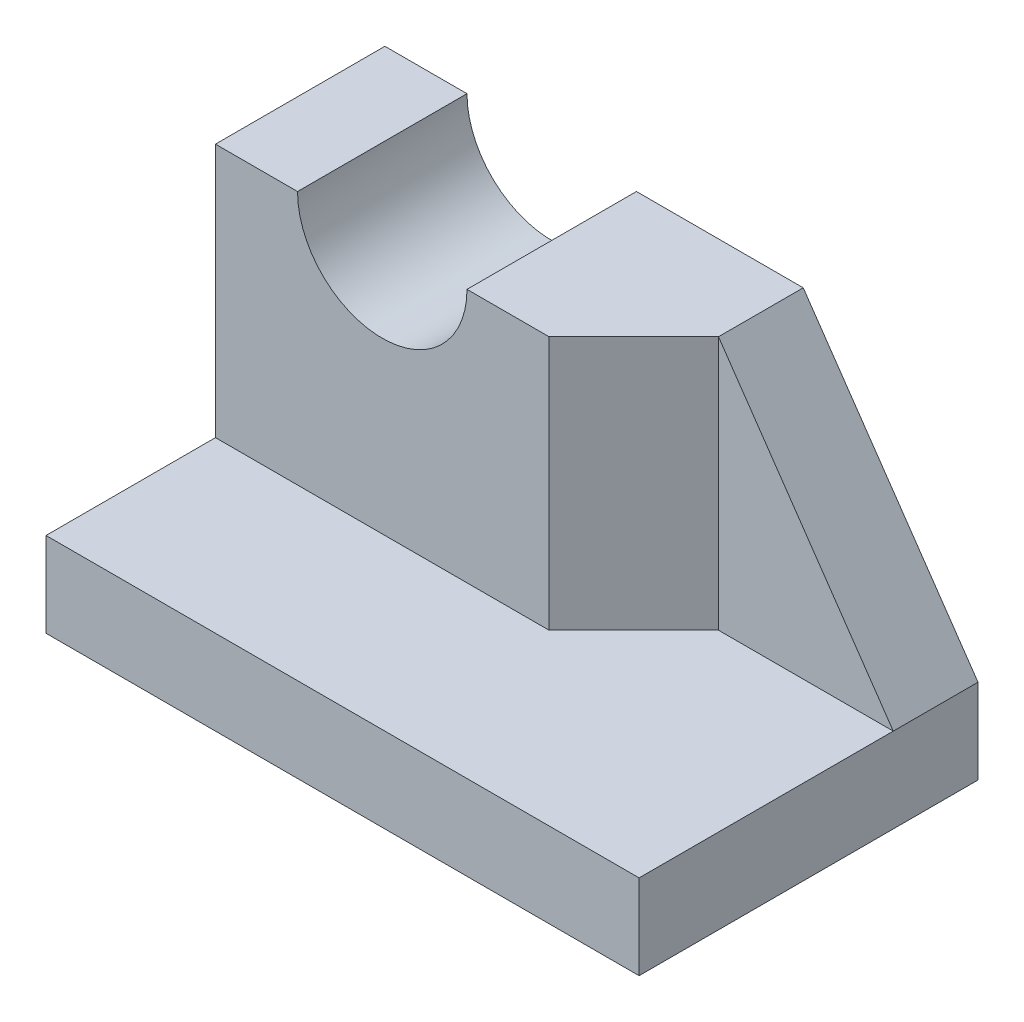
ISO-10303-21;
HEADER;
FILE_DESCRIPTION(('STEP AP214'),'2;1');
FILE_NAME('part.step','',(''),(''),'','','');
FILE_SCHEMA(('AUTOMOTIVE_DESIGN { 1 0 10303 214 1 1 1 1 }'));
ENDSEC;
DATA;
#1=APPLICATION_CONTEXT('core data for automotive mechanical design processes');
#2=APPLICATION_PROTOCOL_DEFINITION('international standard','automotive_design',2000,#1);
#3=PRODUCT_CONTEXT('',#1,'mechanical');
#4=PRODUCT('Part','Part','',(#3));
#5=PRODUCT_RELATED_PRODUCT_CATEGORY('part','',(#4));
#6=PRODUCT_DEFINITION_FORMATION('','',#4);
#7=PRODUCT_DEFINITION_CONTEXT('part definition',#1,'design');
#8=PRODUCT_DEFINITION('design','',#6,#7);
#9=PRODUCT_DEFINITION_SHAPE('','',#8);
#10=(LENGTH_UNIT() NAMED_UNIT(*) SI_UNIT(.MILLI.,.METRE.));
#11=(NAMED_UNIT(*) PLANE_ANGLE_UNIT() SI_UNIT($,.RADIAN.));
#12=(NAMED_UNIT(*) SI_UNIT($,.STERADIAN.) SOLID_ANGLE_UNIT());
#13=UNCERTAINTY_MEASURE_WITH_UNIT(LENGTH_MEASURE(1.E-05),#10,'distance_accuracy_value','');
#14=(GEOMETRIC_REPRESENTATION_CONTEXT(3) GLOBAL_UNCERTAINTY_ASSIGNED_CONTEXT((#13)) GLOBAL_UNIT_ASSIGNED_CONTEXT((#10,
#11,#12)) REPRESENTATION_CONTEXT('',''));
#15=CARTESIAN_POINT('',(0.,0.,0.));
#16=DIRECTION('',(0.,0.,1.));
#17=DIRECTION('',(1.,0.,0.));
#18=AXIS2_PLACEMENT_3D('',#15,#16,#17);
#19=CARTESIAN_POINT('',(35.,10.,-20.));
#20=DIRECTION('',(-1.,0.,0.));
#21=DIRECTION('',(0.,0.,1.));
#22=AXIS2_PLACEMENT_3D('',#19,#20,#21);
#23=PLANE('',#22);
#24=DIRECTION('',(0.,0.,1.));
#25=VECTOR('',#24,1.);
#26=CARTESIAN_POINT('',(35.,10.,-20.));
#27=LINE('',#26,#25);
#28=CARTESIAN_POINT('',(35.,10.,-20.));
#29=VERTEX_POINT('',#28);
#30=CARTESIAN_POINT('',(35.,10.,-10.));
#31=VERTEX_POINT('',#30);
#32=EDGE_CURVE('E133',#29,#31,#27,.T.);
#33=ORIENTED_EDGE('',*,*,#32,.T.);
#34=DIRECTION('',(0.,0.,-1.));
#35=VECTOR('',#34,1.);
#36=CARTESIAN_POINT('',(35.,10.,-20.));
#37=LINE('',#36,#35);
#38=CARTESIAN_POINT('',(35.,10.,20.));
#39=VERTEX_POINT('',#38);
#40=EDGE_CURVE('E180',#39,#31,#37,.T.);
#41=ORIENTED_EDGE('',*,*,#40,.F.);
#42=DIRECTION('',(0.,-1.,0.));
#43=VECTOR('',#42,1.);
#44=CARTESIAN_POINT('',(35.,10.,20.));
#45=LINE('',#44,#43);
#46=CARTESIAN_POINT('',(35.,0.,20.));
#47=VERTEX_POINT('',#46);
#48=EDGE_CURVE('E191',#39,#47,#45,.T.);
#49=ORIENTED_EDGE('',*,*,#48,.T.);
#50=DIRECTION('',(0.,0.,-1.));
#51=VECTOR('',#50,1.);
#52=CARTESIAN_POINT('',(35.,0.,-20.));
#53=LINE('',#52,#51);
#54=CARTESIAN_POINT('',(35.,0.,-20.));
#55=VERTEX_POINT('',#54);
#56=EDGE_CURVE('E179',#47,#55,#53,.T.);
#57=ORIENTED_EDGE('',*,*,#56,.T.);
#58=DIRECTION('',(0.,-1.,0.));
#59=VECTOR('',#58,1.);
#60=CARTESIAN_POINT('',(35.,10.,-20.));
#61=LINE('',#60,#59);
#62=EDGE_CURVE('E12',#29,#55,#61,.T.);
#63=ORIENTED_EDGE('',*,*,#62,.F.);
#64=EDGE_LOOP('',(#33,#41,#49,#57,#63));
#65=FACE_BOUND('',#64,.T.);
#66=ADVANCED_FACE('F40',(#65),#23,.F.);
#67=CARTESIAN_POINT('',(-35.,10.,-20.));
#68=DIRECTION('',(0.,0.,1.));
#69=DIRECTION('',(1.,0.,0.));
#70=AXIS2_PLACEMENT_3D('',#67,#68,#69);
#71=PLANE('',#70);
#72=CARTESIAN_POINT('',(-15.3135783502634,40.,-20.));
#73=DIRECTION('',(0.,0.,-1.));
#74=DIRECTION('',(1.,0.,0.));
#75=AXIS2_PLACEMENT_3D('',#72,#73,#74);
#76=CIRCLE('',#75,10.);
#77=CARTESIAN_POINT('',(-5.31357835026339,40.,-20.));
#78=VERTEX_POINT('',#77);
#79=CARTESIAN_POINT('',(-25.3135783502634,40.,-20.));
#80=VERTEX_POINT('',#79);
#81=EDGE_CURVE('E114',#78,#80,#76,.T.);
#82=ORIENTED_EDGE('',*,*,#81,.F.);
#83=DIRECTION('',(-1.,0.,0.));
#84=VECTOR('',#83,1.);
#85=CARTESIAN_POINT('',(35.,40.,-20.));
#86=LINE('',#85,#84);
#87=CARTESIAN_POINT('',(14.3728432994732,40.,-20.));
#88=VERTEX_POINT('',#87);
#89=EDGE_CURVE('E139',#88,#78,#86,.T.);
#90=ORIENTED_EDGE('',*,*,#89,.F.);
#91=DIRECTION('',(-0.566569047757044,0.824014268155398,0.));
#92=VECTOR('',#91,1.);
#93=CARTESIAN_POINT('',(35.,10.,-20.));
#94=LINE('',#93,#92);
#95=EDGE_CURVE('E63',#29,#88,#94,.T.);
#96=ORIENTED_EDGE('',*,*,#95,.F.);
#97=ORIENTED_EDGE('',*,*,#62,.T.);
#98=DIRECTION('',(-1.,0.,0.));
#99=VECTOR('',#98,1.);
#100=CARTESIAN_POINT('',(-35.,0.,-20.));
#101=LINE('',#100,#99);
#102=CARTESIAN_POINT('',(-35.,0.,-20.));
#103=VERTEX_POINT('',#102);
#104=EDGE_CURVE('E195',#55,#103,#101,.T.);
#105=ORIENTED_EDGE('',*,*,#104,.T.);
#106=DIRECTION('',(0.,-1.,0.));
#107=VECTOR('',#106,1.);
#108=CARTESIAN_POINT('',(-35.,10.,-20.));
#109=LINE('',#108,#107);
#110=CARTESIAN_POINT('',(-35.,40.,-20.));
#111=VERTEX_POINT('',#110);
#112=EDGE_CURVE('E48',#111,#103,#109,.T.);
#113=ORIENTED_EDGE('',*,*,#112,.F.);
#114=EDGE_CURVE('E128',#80,#111,#86,.T.);
#115=ORIENTED_EDGE('',*,*,#114,.F.);
#116=EDGE_LOOP('',(#82,#90,#96,#97,#105,#113,#115));
#117=FACE_BOUND('',#116,.T.);
#118=ADVANCED_FACE('F135',(#117),#71,.F.);
#119=CARTESIAN_POINT('',(-35.,40.,0.));
#120=DIRECTION('',(0.,0.,-1.));
#121=DIRECTION('',(-1.,0.,0.));
#122=AXIS2_PLACEMENT_3D('',#119,#120,#121);
#123=PLANE('',#122);
#124=CARTESIAN_POINT('',(-15.3135783502634,40.,0.));
#125=DIRECTION('',(0.,0.,-1.));
#126=DIRECTION('',(-1.,0.,0.));
#127=AXIS2_PLACEMENT_3D('',#124,#125,#126);
#128=CIRCLE('',#127,10.);
#129=CARTESIAN_POINT('',(-25.3135783502634,40.,0.));
#130=VERTEX_POINT('',#129);
#131=CARTESIAN_POINT('',(-5.31357835026339,40.,0.));
#132=VERTEX_POINT('',#131);
#133=EDGE_CURVE('E55',#130,#132,#128,.F.);
#134=ORIENTED_EDGE('',*,*,#133,.F.);
#135=DIRECTION('',(1.,0.,0.));
#136=VECTOR('',#135,1.);
#137=CARTESIAN_POINT('',(-35.,40.,0.));
#138=LINE('',#137,#136);
#139=CARTESIAN_POINT('',(-35.,40.,0.));
#140=VERTEX_POINT('',#139);
#141=EDGE_CURVE('E131',#140,#130,#138,.T.);
#142=ORIENTED_EDGE('',*,*,#141,.F.);
#143=DIRECTION('',(0.,-1.,0.));
#144=VECTOR('',#143,1.);
#145=CARTESIAN_POINT('',(-35.,40.,0.));
#146=LINE('',#145,#144);
#147=CARTESIAN_POINT('',(-35.,10.,0.));
#148=VERTEX_POINT('',#147);
#149=EDGE_CURVE('E175',#140,#148,#146,.T.);
#150=ORIENTED_EDGE('',*,*,#149,.T.);
#151=DIRECTION('',(1.,0.,0.));
#152=VECTOR('',#151,1.);
#153=CARTESIAN_POINT('',(-35.,10.,0.));
#154=LINE('',#153,#152);
#155=CARTESIAN_POINT('',(4.37284329947321,10.,0.));
#156=VERTEX_POINT('',#155);
#157=EDGE_CURVE('E161',#148,#156,#154,.T.);
#158=ORIENTED_EDGE('',*,*,#157,.T.);
#159=DIRECTION('',(0.,-1.,0.));
#160=VECTOR('',#159,1.);
#161=CARTESIAN_POINT('',(4.37284329947321,40.,0.));
#162=LINE('',#161,#160);
#163=CARTESIAN_POINT('',(4.37284329947321,40.,0.));
#164=VERTEX_POINT('',#163);
#165=EDGE_CURVE('E171',#164,#156,#162,.T.);
#166=ORIENTED_EDGE('',*,*,#165,.F.);
#167=EDGE_CURVE('E153',#132,#164,#138,.T.);
#168=ORIENTED_EDGE('',*,*,#167,.F.);
#169=EDGE_LOOP('',(#134,#142,#150,#158,#166,#168));
#170=FACE_BOUND('',#169,.T.);
#171=ADVANCED_FACE('F241',(#170),#123,.F.);
#172=CARTESIAN_POINT('',(14.3728432994732,40.,-10.));
#173=DIRECTION('',(0.,0.,-1.));
#174=DIRECTION('',(-1.,0.,0.));
#175=AXIS2_PLACEMENT_3D('',#172,#173,#174);
#176=PLANE('',#175);
#177=DIRECTION('',(0.566569047757044,-0.824014268155398,0.));
#178=VECTOR('',#177,1.);
#179=CARTESIAN_POINT('',(14.3728432994732,40.,-10.));
#180=LINE('',#179,#178);
#181=CARTESIAN_POINT('',(14.3728432994732,40.,-10.));
#182=VERTEX_POINT('',#181);
#183=EDGE_CURVE('E233',#182,#31,#180,.T.);
#184=ORIENTED_EDGE('',*,*,#183,.F.);
#185=DIRECTION('',(0.,-1.,0.));
#186=VECTOR('',#185,1.);
#187=CARTESIAN_POINT('',(14.3728432994732,40.,-10.));
#188=LINE('',#187,#186);
#189=CARTESIAN_POINT('',(14.3728432994732,10.,-10.));
#190=VERTEX_POINT('',#189);
#191=EDGE_CURVE('E160',#182,#190,#188,.T.);
#192=ORIENTED_EDGE('',*,*,#191,.T.);
#193=DIRECTION('',(1.,0.,0.));
#194=VECTOR('',#193,1.);
#195=CARTESIAN_POINT('',(14.3728432994732,10.,-10.));
#196=LINE('',#195,#194);
#197=EDGE_CURVE('E140',#190,#31,#196,.T.);
#198=ORIENTED_EDGE('',*,*,#197,.T.);
#199=EDGE_LOOP('',(#184,#192,#198));
#200=FACE_BOUND('',#199,.T.);
#201=ADVANCED_FACE('F232',(#200),#176,.F.);
#202=CARTESIAN_POINT('',(0.,40.,0.));
#203=DIRECTION('',(0.,1.,0.));
#204=DIRECTION('',(0.,0.,1.));
#205=AXIS2_PLACEMENT_3D('',#202,#203,#204);
#206=PLANE('',#205);
#207=ORIENTED_EDGE('',*,*,#141,.T.);
#208=DIRECTION('',(0.,0.,1.));
#209=VECTOR('',#208,1.);
#210=CARTESIAN_POINT('',(-25.3135783502634,40.,-20.));
#211=LINE('',#210,#209);
#212=EDGE_CURVE('E117',#80,#130,#211,.T.);
#213=ORIENTED_EDGE('',*,*,#212,.F.);
#214=ORIENTED_EDGE('',*,*,#114,.T.);
#215=DIRECTION('',(0.,0.,1.));
#216=VECTOR('',#215,1.);
#217=CARTESIAN_POINT('',(-35.,40.,-20.));
#218=LINE('',#217,#216);
#219=EDGE_CURVE('E144',#111,#140,#218,.T.);
#220=ORIENTED_EDGE('',*,*,#219,.T.);
#221=EDGE_LOOP('',(#207,#213,#214,#220));
#222=FACE_BOUND('',#221,.T.);
#223=ADVANCED_FACE('F127',(#222),#206,.T.);
#224=ORIENTED_EDGE('',*,*,#89,.T.);
#225=DIRECTION('',(0.,0.,1.));
#226=VECTOR('',#225,1.);
#227=CARTESIAN_POINT('',(-5.31357835026339,40.,-20.));
#228=LINE('',#227,#226);
#229=EDGE_CURVE('E118',#78,#132,#228,.T.);
#230=ORIENTED_EDGE('',*,*,#229,.T.);
#231=ORIENTED_EDGE('',*,*,#167,.T.);
#232=DIRECTION('',(0.707106781186546,0.,-0.707106781186549));
#233=VECTOR('',#232,1.);
#234=CARTESIAN_POINT('',(4.37284329947321,40.,0.));
#235=LINE('',#234,#233);
#236=EDGE_CURVE('E156',#164,#182,#235,.T.);
#237=ORIENTED_EDGE('',*,*,#236,.T.);
#238=DIRECTION('',(0.,0.,1.));
#239=VECTOR('',#238,1.);
#240=CARTESIAN_POINT('',(14.3728432994732,40.,-20.));
#241=LINE('',#240,#239);
#242=EDGE_CURVE('E246',#88,#182,#241,.T.);
#243=ORIENTED_EDGE('',*,*,#242,.F.);
#244=EDGE_LOOP('',(#224,#230,#231,#237,#243));
#245=FACE_BOUND('',#244,.T.);
#246=ADVANCED_FACE('F256',(#245),#206,.T.);
#247=CARTESIAN_POINT('',(-35.,10.,-20.));
#248=DIRECTION('',(1.,0.,0.));
#249=DIRECTION('',(0.,0.,-1.));
#250=AXIS2_PLACEMENT_3D('',#247,#248,#249);
#251=PLANE('',#250);
#252=DIRECTION('',(0.,0.,1.));
#253=VECTOR('',#252,1.);
#254=CARTESIAN_POINT('',(-35.,0.,-20.));
#255=LINE('',#254,#253);
#256=CARTESIAN_POINT('',(-35.,0.,20.));
#257=VERTEX_POINT('',#256);
#258=EDGE_CURVE('E198',#103,#257,#255,.T.);
#259=ORIENTED_EDGE('',*,*,#258,.T.);
#260=DIRECTION('',(0.,-1.,0.));
#261=VECTOR('',#260,1.);
#262=CARTESIAN_POINT('',(-35.,10.,20.));
#263=LINE('',#262,#261);
#264=CARTESIAN_POINT('',(-35.,10.,20.));
#265=VERTEX_POINT('',#264);
#266=EDGE_CURVE('E206',#265,#257,#263,.T.);
#267=ORIENTED_EDGE('',*,*,#266,.F.);
#268=DIRECTION('',(0.,0.,1.));
#269=VECTOR('',#268,1.);
#270=CARTESIAN_POINT('',(-35.,10.,-20.));
#271=LINE('',#270,#269);
#272=EDGE_CURVE('E184',#148,#265,#271,.T.);
#273=ORIENTED_EDGE('',*,*,#272,.F.);
#274=ORIENTED_EDGE('',*,*,#149,.F.);
#275=ORIENTED_EDGE('',*,*,#219,.F.);
#276=ORIENTED_EDGE('',*,*,#112,.T.);
#277=EDGE_LOOP('',(#259,#267,#273,#274,#275,#276));
#278=FACE_BOUND('',#277,.T.);
#279=ADVANCED_FACE('F212',(#278),#251,.F.);
#280=CARTESIAN_POINT('',(-35.,10.,20.));
#281=DIRECTION('',(0.,0.,-1.));
#282=DIRECTION('',(-1.,0.,0.));
#283=AXIS2_PLACEMENT_3D('',#280,#281,#282);
#284=PLANE('',#283);
#285=DIRECTION('',(1.,0.,0.));
#286=VECTOR('',#285,1.);
#287=CARTESIAN_POINT('',(-35.,0.,20.));
#288=LINE('',#287,#286);
#289=EDGE_CURVE('E185',#257,#47,#288,.T.);
#290=ORIENTED_EDGE('',*,*,#289,.T.);
#291=ORIENTED_EDGE('',*,*,#48,.F.);
#292=DIRECTION('',(1.,0.,0.));
#293=VECTOR('',#292,1.);
#294=CARTESIAN_POINT('',(-35.,10.,20.));
#295=LINE('',#294,#293);
#296=EDGE_CURVE('E188',#265,#39,#295,.T.);
#297=ORIENTED_EDGE('',*,*,#296,.F.);
#298=ORIENTED_EDGE('',*,*,#266,.T.);
#299=EDGE_LOOP('',(#290,#291,#297,#298));
#300=FACE_BOUND('',#299,.T.);
#301=ADVANCED_FACE('F222',(#300),#284,.F.);
#302=CARTESIAN_POINT('',(0.,10.,0.));
#303=DIRECTION('',(0.,1.,0.));
#304=DIRECTION('',(0.,0.,1.));
#305=AXIS2_PLACEMENT_3D('',#302,#303,#304);
#306=PLANE('',#305);
#307=ORIENTED_EDGE('',*,*,#197,.F.);
#308=DIRECTION('',(0.707106781186546,0.,-0.707106781186549));
#309=VECTOR('',#308,1.);
#310=CARTESIAN_POINT('',(4.37284329947321,10.,0.));
#311=LINE('',#310,#309);
#312=EDGE_CURVE('E146',#156,#190,#311,.T.);
#313=ORIENTED_EDGE('',*,*,#312,.F.);
#314=ORIENTED_EDGE('',*,*,#157,.F.);
#315=ORIENTED_EDGE('',*,*,#272,.T.);
#316=ORIENTED_EDGE('',*,*,#296,.T.);
#317=ORIENTED_EDGE('',*,*,#40,.T.);
#318=EDGE_LOOP('',(#307,#313,#314,#315,#316,#317));
#319=FACE_BOUND('',#318,.T.);
#320=ADVANCED_FACE('F229',(#319),#306,.T.);
#321=CARTESIAN_POINT('',(0.,0.,0.));
#322=DIRECTION('',(0.,1.,0.));
#323=DIRECTION('',(0.,0.,1.));
#324=AXIS2_PLACEMENT_3D('',#321,#322,#323);
#325=PLANE('',#324);
#326=ORIENTED_EDGE('',*,*,#56,.F.);
#327=ORIENTED_EDGE('',*,*,#289,.F.);
#328=ORIENTED_EDGE('',*,*,#258,.F.);
#329=ORIENTED_EDGE('',*,*,#104,.F.);
#330=EDGE_LOOP('',(#326,#327,#328,#329));
#331=FACE_BOUND('',#330,.T.);
#332=ADVANCED_FACE('F219',(#331),#325,.F.);
#333=CARTESIAN_POINT('',(4.37284329947321,40.,0.));
#334=DIRECTION('',(-0.707106781186549,0.,-0.707106781186546));
#335=DIRECTION('',(-0.707106781186546,0.,0.707106781186549));
#336=AXIS2_PLACEMENT_3D('',#333,#334,#335);
#337=PLANE('',#336);
#338=ORIENTED_EDGE('',*,*,#312,.T.);
#339=ORIENTED_EDGE('',*,*,#191,.F.);
#340=ORIENTED_EDGE('',*,*,#236,.F.);
#341=ORIENTED_EDGE('',*,*,#165,.T.);
#342=EDGE_LOOP('',(#338,#339,#340,#341));
#343=FACE_BOUND('',#342,.T.);
#344=ADVANCED_FACE('F237',(#343),#337,.F.);
#345=CARTESIAN_POINT('',(35.,10.,-20.));
#346=DIRECTION('',(0.824014268155398,0.566569047757044,0.));
#347=DIRECTION('',(-0.566569047757044,0.824014268155398,0.));
#348=AXIS2_PLACEMENT_3D('',#345,#346,#347);
#349=PLANE('',#348);
#350=ORIENTED_EDGE('',*,*,#183,.T.);
#351=ORIENTED_EDGE('',*,*,#32,.F.);
#352=ORIENTED_EDGE('',*,*,#95,.T.);
#353=ORIENTED_EDGE('',*,*,#242,.T.);
#354=EDGE_LOOP('',(#350,#351,#352,#353));
#355=FACE_BOUND('',#354,.T.);
#356=ADVANCED_FACE('F254',(#355),#349,.T.);
#357=CARTESIAN_POINT('',(-15.3135783502634,40.,-20.));
#358=DIRECTION('',(0.,0.,1.));
#359=DIRECTION('',(1.,0.,0.));
#360=AXIS2_PLACEMENT_3D('',#357,#358,#359);
#361=CYLINDRICAL_SURFACE('',#360,10.);
#362=ORIENTED_EDGE('',*,*,#133,.T.);
#363=ORIENTED_EDGE('',*,*,#229,.F.);
#364=ORIENTED_EDGE('',*,*,#81,.T.);
#365=ORIENTED_EDGE('',*,*,#212,.T.);
#366=EDGE_LOOP('',(#362,#363,#364,#365));
#367=FACE_BOUND('',#366,.T.);
#368=ADVANCED_FACE('F116',(#367),#361,.F.);
#369=CLOSED_SHELL('',(#66,#118,#171,#201,#223,#246,#279,#301,#320,#332,#344,#356,#368));
#370=MANIFOLD_SOLID_BREP('B2',#369);
#371=ADVANCED_BREP_SHAPE_REPRESENTATION('',(#18,#370),#14);
#372=SHAPE_DEFINITION_REPRESENTATION(#9,#371);
ENDSEC;
END-ISO-10303-21;
